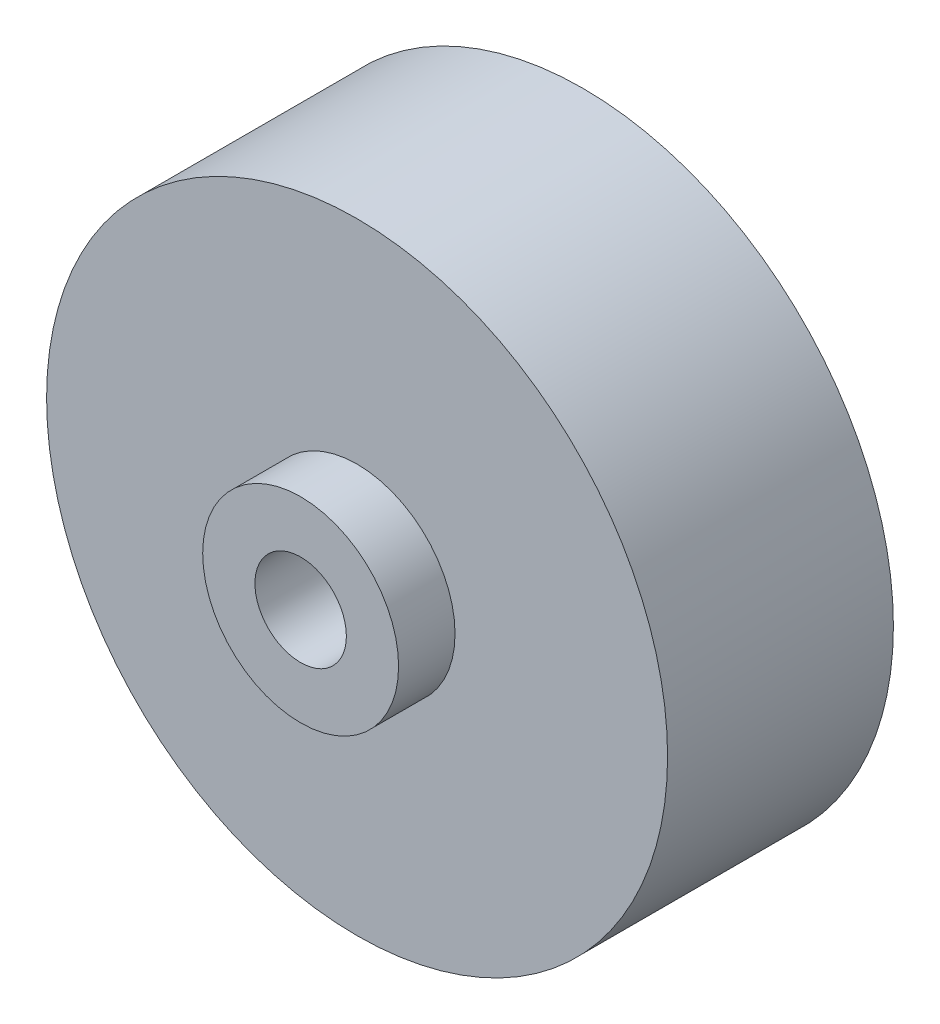
ISO-10303-21;
HEADER;
FILE_DESCRIPTION(('STEP AP214'),'2;1');
FILE_NAME('part.step','',(''),(''),'','','');
FILE_SCHEMA(('AUTOMOTIVE_DESIGN { 1 0 10303 214 1 1 1 1 }'));
ENDSEC;
DATA;
#1=APPLICATION_CONTEXT('core data for automotive mechanical design processes');
#2=APPLICATION_PROTOCOL_DEFINITION('international standard','automotive_design',2000,#1);
#3=PRODUCT_CONTEXT('',#1,'mechanical');
#4=PRODUCT('Part','Part','',(#3));
#5=PRODUCT_RELATED_PRODUCT_CATEGORY('part','',(#4));
#6=PRODUCT_DEFINITION_FORMATION('','',#4);
#7=PRODUCT_DEFINITION_CONTEXT('part definition',#1,'design');
#8=PRODUCT_DEFINITION('design','',#6,#7);
#9=PRODUCT_DEFINITION_SHAPE('','',#8);
#10=(LENGTH_UNIT() NAMED_UNIT(*) SI_UNIT(.MILLI.,.METRE.));
#11=(NAMED_UNIT(*) PLANE_ANGLE_UNIT() SI_UNIT($,.RADIAN.));
#12=(NAMED_UNIT(*) SI_UNIT($,.STERADIAN.) SOLID_ANGLE_UNIT());
#13=UNCERTAINTY_MEASURE_WITH_UNIT(LENGTH_MEASURE(1.E-05),#10,'distance_accuracy_value','');
#14=(GEOMETRIC_REPRESENTATION_CONTEXT(3) GLOBAL_UNCERTAINTY_ASSIGNED_CONTEXT((#13)) GLOBAL_UNIT_ASSIGNED_CONTEXT((#10,
#11,#12)) REPRESENTATION_CONTEXT('',''));
#15=CARTESIAN_POINT('',(0.,0.,0.));
#16=DIRECTION('',(0.,0.,1.));
#17=DIRECTION('',(1.,0.,0.));
#18=AXIS2_PLACEMENT_3D('',#15,#16,#17);
#19=CARTESIAN_POINT('',(0.,0.,10.));
#20=DIRECTION('',(0.,0.,-1.));
#21=DIRECTION('',(-1.,0.,0.));
#22=AXIS2_PLACEMENT_3D('',#19,#20,#21);
#23=CYLINDRICAL_SURFACE('',#22,27.5);
#24=CARTESIAN_POINT('',(0.,0.,10.));
#25=DIRECTION('',(0.,0.,1.));
#26=DIRECTION('',(1.,0.,0.));
#27=AXIS2_PLACEMENT_3D('',#24,#25,#26);
#28=CIRCLE('',#27,27.5);
#29=CARTESIAN_POINT('',(27.5,0.,10.));
#30=VERTEX_POINT('',#29);
#31=EDGE_CURVE('E10',#30,#30,#28,.T.);
#32=ORIENTED_EDGE('',*,*,#31,.F.);
#33=EDGE_LOOP('',(#32));
#34=FACE_BOUND('',#33,.T.);
#35=CARTESIAN_POINT('',(0.,0.,-10.));
#36=DIRECTION('',(0.,0.,1.));
#37=DIRECTION('',(1.,0.,0.));
#38=AXIS2_PLACEMENT_3D('',#35,#36,#37);
#39=CIRCLE('',#38,27.5);
#40=CARTESIAN_POINT('',(27.5,0.,-10.));
#41=VERTEX_POINT('',#40);
#42=EDGE_CURVE('E38',#41,#41,#39,.T.);
#43=ORIENTED_EDGE('',*,*,#42,.T.);
#44=EDGE_LOOP('',(#43));
#45=FACE_BOUND('',#44,.T.);
#46=ADVANCED_FACE('F31',(#34,#45),#23,.T.);
#47=CARTESIAN_POINT('',(0.,0.,10.));
#48=DIRECTION('',(0.,0.,1.));
#49=DIRECTION('',(1.,0.,0.));
#50=AXIS2_PLACEMENT_3D('',#47,#48,#49);
#51=PLANE('',#50);
#52=CARTESIAN_POINT('',(0.,0.,10.));
#53=DIRECTION('',(0.,0.,1.));
#54=DIRECTION('',(1.,0.,0.));
#55=AXIS2_PLACEMENT_3D('',#52,#53,#54);
#56=CIRCLE('',#55,8.675);
#57=CARTESIAN_POINT('',(8.675,0.,10.));
#58=VERTEX_POINT('',#57);
#59=EDGE_CURVE('E46',#58,#58,#56,.T.);
#60=ORIENTED_EDGE('',*,*,#59,.F.);
#61=EDGE_LOOP('',(#60));
#62=FACE_BOUND('',#61,.T.);
#63=ORIENTED_EDGE('',*,*,#31,.T.);
#64=EDGE_LOOP('',(#63));
#65=FACE_BOUND('',#64,.T.);
#66=ADVANCED_FACE('F73',(#62,#65),#51,.T.);
#67=CARTESIAN_POINT('',(0.,0.,-10.));
#68=DIRECTION('',(0.,0.,1.));
#69=DIRECTION('',(1.,0.,0.));
#70=AXIS2_PLACEMENT_3D('',#67,#68,#69);
#71=PLANE('',#70);
#72=CARTESIAN_POINT('',(0.,0.,-9.99999999999999));
#73=DIRECTION('',(0.,0.,1.));
#74=DIRECTION('',(1.,0.,0.));
#75=AXIS2_PLACEMENT_3D('',#72,#73,#74);
#76=CIRCLE('',#75,4.05);
#77=CARTESIAN_POINT('',(4.05,0.,-9.99999999999999));
#78=VERTEX_POINT('',#77);
#79=EDGE_CURVE('E43',#78,#78,#76,.T.);
#80=ORIENTED_EDGE('',*,*,#79,.T.);
#81=EDGE_LOOP('',(#80));
#82=FACE_BOUND('',#81,.T.);
#83=ORIENTED_EDGE('',*,*,#42,.F.);
#84=EDGE_LOOP('',(#83));
#85=FACE_BOUND('',#84,.T.);
#86=ADVANCED_FACE('F79',(#82,#85),#71,.F.);
#87=CARTESIAN_POINT('',(0.,0.,-98.));
#88=DIRECTION('',(0.,0.,1.));
#89=DIRECTION('',(1.,0.,0.));
#90=AXIS2_PLACEMENT_3D('',#87,#88,#89);
#91=CYLINDRICAL_SURFACE('',#90,4.05);
#92=ORIENTED_EDGE('',*,*,#79,.F.);
#93=EDGE_LOOP('',(#92));
#94=FACE_BOUND('',#93,.T.);
#95=CARTESIAN_POINT('',(0.,0.,15.));
#96=DIRECTION('',(0.,0.,1.));
#97=DIRECTION('',(1.,0.,0.));
#98=AXIS2_PLACEMENT_3D('',#95,#96,#97);
#99=CIRCLE('',#98,4.05);
#100=CARTESIAN_POINT('',(4.05,0.,15.));
#101=VERTEX_POINT('',#100);
#102=EDGE_CURVE('E34',#101,#101,#99,.T.);
#103=ORIENTED_EDGE('',*,*,#102,.T.);
#104=EDGE_LOOP('',(#103));
#105=FACE_BOUND('',#104,.T.);
#106=ADVANCED_FACE('F61',(#94,#105),#91,.F.);
#107=CARTESIAN_POINT('',(0.,0.,15.));
#108=DIRECTION('',(0.,0.,-1.));
#109=DIRECTION('',(-1.,0.,0.));
#110=AXIS2_PLACEMENT_3D('',#107,#108,#109);
#111=CYLINDRICAL_SURFACE('',#110,8.675);
#112=CARTESIAN_POINT('',(0.,0.,15.));
#113=DIRECTION('',(0.,0.,1.));
#114=DIRECTION('',(1.,0.,0.));
#115=AXIS2_PLACEMENT_3D('',#112,#113,#114);
#116=CIRCLE('',#115,8.675);
#117=CARTESIAN_POINT('',(8.675,0.,15.));
#118=VERTEX_POINT('',#117);
#119=EDGE_CURVE('E49',#118,#118,#116,.T.);
#120=ORIENTED_EDGE('',*,*,#119,.F.);
#121=EDGE_LOOP('',(#120));
#122=FACE_BOUND('',#121,.T.);
#123=ORIENTED_EDGE('',*,*,#59,.T.);
#124=EDGE_LOOP('',(#123));
#125=FACE_BOUND('',#124,.T.);
#126=ADVANCED_FACE('F65',(#122,#125),#111,.T.);
#127=CARTESIAN_POINT('',(0.,0.,15.));
#128=DIRECTION('',(0.,0.,1.));
#129=DIRECTION('',(1.,0.,0.));
#130=AXIS2_PLACEMENT_3D('',#127,#128,#129);
#131=PLANE('',#130);
#132=ORIENTED_EDGE('',*,*,#102,.F.);
#133=EDGE_LOOP('',(#132));
#134=FACE_BOUND('',#133,.T.);
#135=ORIENTED_EDGE('',*,*,#119,.T.);
#136=EDGE_LOOP('',(#135));
#137=FACE_BOUND('',#136,.T.);
#138=ADVANCED_FACE('F63',(#134,#137),#131,.T.);
#139=CLOSED_SHELL('',(#46,#66,#86,#106,#126,#138));
#140=MANIFOLD_SOLID_BREP('B2',#139);
#141=ADVANCED_BREP_SHAPE_REPRESENTATION('',(#18,#140),#14);
#142=SHAPE_DEFINITION_REPRESENTATION(#9,#141);
ENDSEC;
END-ISO-10303-21;
